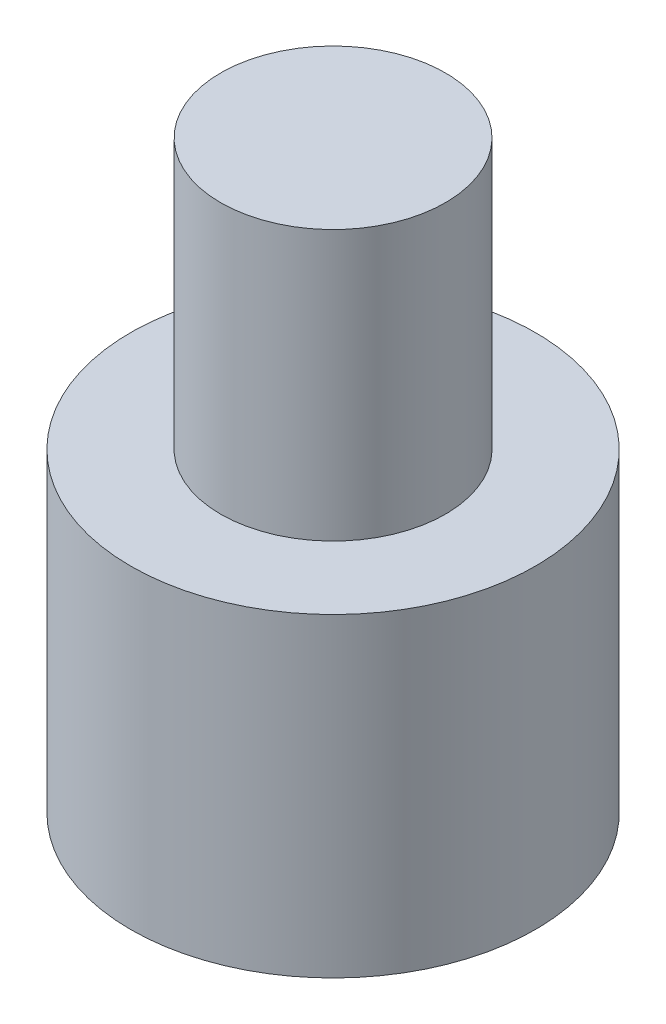
ISO-10303-21;
HEADER;
FILE_DESCRIPTION(('STEP AP214'),'2;1');
FILE_NAME('part.step','',(''),(''),'','','');
FILE_SCHEMA(('AUTOMOTIVE_DESIGN { 1 0 10303 214 1 1 1 1 }'));
ENDSEC;
DATA;
#1=APPLICATION_CONTEXT('core data for automotive mechanical design processes');
#2=APPLICATION_PROTOCOL_DEFINITION('international standard','automotive_design',2000,#1);
#3=PRODUCT_CONTEXT('',#1,'mechanical');
#4=PRODUCT('Part','Part','',(#3));
#5=PRODUCT_RELATED_PRODUCT_CATEGORY('part','',(#4));
#6=PRODUCT_DEFINITION_FORMATION('','',#4);
#7=PRODUCT_DEFINITION_CONTEXT('part definition',#1,'design');
#8=PRODUCT_DEFINITION('design','',#6,#7);
#9=PRODUCT_DEFINITION_SHAPE('','',#8);
#10=(LENGTH_UNIT() NAMED_UNIT(*) SI_UNIT(.MILLI.,.METRE.));
#11=(NAMED_UNIT(*) PLANE_ANGLE_UNIT() SI_UNIT($,.RADIAN.));
#12=(NAMED_UNIT(*) SI_UNIT($,.STERADIAN.) SOLID_ANGLE_UNIT());
#13=UNCERTAINTY_MEASURE_WITH_UNIT(LENGTH_MEASURE(1.E-05),#10,'distance_accuracy_value','');
#14=(GEOMETRIC_REPRESENTATION_CONTEXT(3) GLOBAL_UNCERTAINTY_ASSIGNED_CONTEXT((#13)) GLOBAL_UNIT_ASSIGNED_CONTEXT((#10,
#11,#12)) REPRESENTATION_CONTEXT('',''));
#15=CARTESIAN_POINT('',(0.,0.,0.));
#16=DIRECTION('',(0.,0.,1.));
#17=DIRECTION('',(1.,0.,0.));
#18=AXIS2_PLACEMENT_3D('',#15,#16,#17);
#19=CARTESIAN_POINT('',(0.,6.99999999999999,0.));
#20=DIRECTION('',(0.,-1.,0.));
#21=DIRECTION('',(0.,0.,-1.));
#22=AXIS2_PLACEMENT_3D('',#19,#20,#21);
#23=CYLINDRICAL_SURFACE('',#22,4.5);
#24=CARTESIAN_POINT('',(0.,6.99999999999999,0.));
#25=DIRECTION('',(0.,1.,0.));
#26=DIRECTION('',(0.,0.,1.));
#27=AXIS2_PLACEMENT_3D('',#24,#25,#26);
#28=CIRCLE('',#27,4.5);
#29=CARTESIAN_POINT('',(0.,6.99999999999999,4.5));
#30=VERTEX_POINT('',#29);
#31=EDGE_CURVE('E44',#30,#30,#28,.T.);
#32=ORIENTED_EDGE('',*,*,#31,.F.);
#33=EDGE_LOOP('',(#32));
#34=FACE_BOUND('',#33,.T.);
#35=CARTESIAN_POINT('',(0.,0.,0.));
#36=DIRECTION('',(0.,1.,0.));
#37=DIRECTION('',(0.,0.,1.));
#38=AXIS2_PLACEMENT_3D('',#35,#36,#37);
#39=CIRCLE('',#38,4.5);
#40=CARTESIAN_POINT('',(0.,0.,4.5));
#41=VERTEX_POINT('',#40);
#42=EDGE_CURVE('E40',#41,#41,#39,.T.);
#43=ORIENTED_EDGE('',*,*,#42,.T.);
#44=EDGE_LOOP('',(#43));
#45=FACE_BOUND('',#44,.T.);
#46=ADVANCED_FACE('F37',(#34,#45),#23,.T.);
#47=CARTESIAN_POINT('',(0.,6.99999999999999,0.));
#48=DIRECTION('',(0.,1.,0.));
#49=DIRECTION('',(0.,0.,1.));
#50=AXIS2_PLACEMENT_3D('',#47,#48,#49);
#51=PLANE('',#50);
#52=CARTESIAN_POINT('',(0.,6.99999999999999,0.));
#53=DIRECTION('',(0.,1.,0.));
#54=DIRECTION('',(0.,0.,1.));
#55=AXIS2_PLACEMENT_3D('',#52,#53,#54);
#56=CIRCLE('',#55,2.5);
#57=CARTESIAN_POINT('',(0.,6.99999999999999,2.5));
#58=VERTEX_POINT('',#57);
#59=EDGE_CURVE('E10',#58,#58,#56,.T.);
#60=ORIENTED_EDGE('',*,*,#59,.F.);
#61=EDGE_LOOP('',(#60));
#62=FACE_BOUND('',#61,.T.);
#63=ORIENTED_EDGE('',*,*,#31,.T.);
#64=EDGE_LOOP('',(#63));
#65=FACE_BOUND('',#64,.T.);
#66=ADVANCED_FACE('F78',(#62,#65),#51,.T.);
#67=CARTESIAN_POINT('',(0.,0.,0.));
#68=DIRECTION('',(0.,1.,0.));
#69=DIRECTION('',(0.,0.,1.));
#70=AXIS2_PLACEMENT_3D('',#67,#68,#69);
#71=PLANE('',#70);
#72=CARTESIAN_POINT('',(0.,0.,0.));
#73=DIRECTION('',(0.,-1.,0.));
#74=DIRECTION('',(0.,0.,-1.));
#75=AXIS2_PLACEMENT_3D('',#72,#73,#74);
#76=CIRCLE('',#75,1.675);
#77=CARTESIAN_POINT('',(0.,0.,-1.675));
#78=VERTEX_POINT('',#77);
#79=EDGE_CURVE('E55',#78,#78,#76,.T.);
#80=ORIENTED_EDGE('',*,*,#79,.F.);
#81=EDGE_LOOP('',(#80));
#82=FACE_BOUND('',#81,.T.);
#83=ORIENTED_EDGE('',*,*,#42,.F.);
#84=EDGE_LOOP('',(#83));
#85=FACE_BOUND('',#84,.T.);
#86=ADVANCED_FACE('F83',(#82,#85),#71,.F.);
#87=CARTESIAN_POINT('',(0.,6.,0.));
#88=DIRECTION('',(0.,-1.,0.));
#89=DIRECTION('',(0.,0.,-1.));
#90=AXIS2_PLACEMENT_3D('',#87,#88,#89);
#91=CYLINDRICAL_SURFACE('',#90,1.675);
#92=CARTESIAN_POINT('',(0.,6.,0.));
#93=DIRECTION('',(0.,-1.,0.));
#94=DIRECTION('',(0.,0.,-1.));
#95=AXIS2_PLACEMENT_3D('',#92,#93,#94);
#96=CIRCLE('',#95,1.675);
#97=CARTESIAN_POINT('',(0.,6.,-1.675));
#98=VERTEX_POINT('',#97);
#99=EDGE_CURVE('E52',#98,#98,#96,.T.);
#100=ORIENTED_EDGE('',*,*,#99,.F.);
#101=EDGE_LOOP('',(#100));
#102=FACE_BOUND('',#101,.T.);
#103=ORIENTED_EDGE('',*,*,#79,.T.);
#104=EDGE_LOOP('',(#103));
#105=FACE_BOUND('',#104,.T.);
#106=ADVANCED_FACE('F74',(#102,#105),#91,.F.);
#107=CARTESIAN_POINT('',(0.,6.,0.));
#108=DIRECTION('',(0.,-1.,0.));
#109=DIRECTION('',(0.,0.,-1.));
#110=AXIS2_PLACEMENT_3D('',#107,#108,#109);
#111=PLANE('',#110);
#112=ORIENTED_EDGE('',*,*,#99,.T.);
#113=EDGE_LOOP('',(#112));
#114=FACE_BOUND('',#113,.T.);
#115=ADVANCED_FACE('F66',(#114),#111,.T.);
#116=CARTESIAN_POINT('',(0.,13.,0.));
#117=DIRECTION('',(0.,-1.,0.));
#118=DIRECTION('',(0.,0.,-1.));
#119=AXIS2_PLACEMENT_3D('',#116,#117,#118);
#120=CYLINDRICAL_SURFACE('',#119,2.5);
#121=CARTESIAN_POINT('',(0.,13.,0.));
#122=DIRECTION('',(0.,1.,0.));
#123=DIRECTION('',(0.,0.,1.));
#124=AXIS2_PLACEMENT_3D('',#121,#122,#123);
#125=CIRCLE('',#124,2.5);
#126=CARTESIAN_POINT('',(0.,13.,2.5));
#127=VERTEX_POINT('',#126);
#128=EDGE_CURVE('E51',#127,#127,#125,.T.);
#129=ORIENTED_EDGE('',*,*,#128,.F.);
#130=EDGE_LOOP('',(#129));
#131=FACE_BOUND('',#130,.T.);
#132=ORIENTED_EDGE('',*,*,#59,.T.);
#133=EDGE_LOOP('',(#132));
#134=FACE_BOUND('',#133,.T.);
#135=ADVANCED_FACE('F64',(#131,#134),#120,.T.);
#136=CARTESIAN_POINT('',(0.,13.,0.));
#137=DIRECTION('',(0.,1.,0.));
#138=DIRECTION('',(0.,0.,1.));
#139=AXIS2_PLACEMENT_3D('',#136,#137,#138);
#140=PLANE('',#139);
#141=ORIENTED_EDGE('',*,*,#128,.T.);
#142=EDGE_LOOP('',(#141));
#143=FACE_BOUND('',#142,.T.);
#144=ADVANCED_FACE('F62',(#143),#140,.T.);
#145=CLOSED_SHELL('',(#46,#66,#86,#106,#115,#135,#144));
#146=MANIFOLD_SOLID_BREP('B2',#145);
#147=ADVANCED_BREP_SHAPE_REPRESENTATION('',(#18,#146),#14);
#148=SHAPE_DEFINITION_REPRESENTATION(#9,#147);
ENDSEC;
END-ISO-10303-21;
